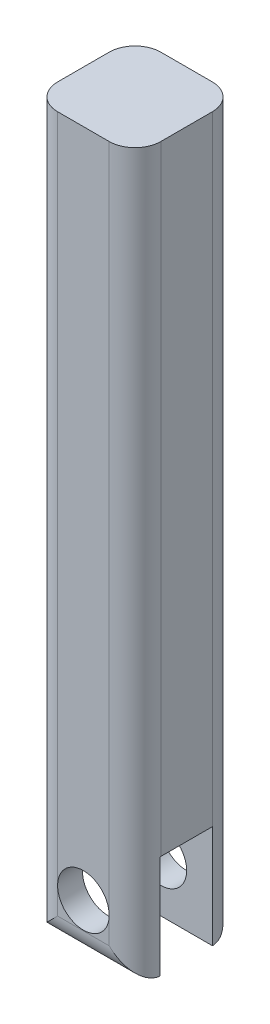
ISO-10303-21;
HEADER;
FILE_DESCRIPTION(('STEP AP214'),'2;1');
FILE_NAME('part.step','',(''),(''),'','','');
FILE_SCHEMA(('AUTOMOTIVE_DESIGN { 1 0 10303 214 1 1 1 1 }'));
ENDSEC;
DATA;
#1=APPLICATION_CONTEXT('core data for automotive mechanical design processes');
#2=APPLICATION_PROTOCOL_DEFINITION('international standard','automotive_design',2000,#1);
#3=PRODUCT_CONTEXT('',#1,'mechanical');
#4=PRODUCT('Part','Part','',(#3));
#5=PRODUCT_RELATED_PRODUCT_CATEGORY('part','',(#4));
#6=PRODUCT_DEFINITION_FORMATION('','',#4);
#7=PRODUCT_DEFINITION_CONTEXT('part definition',#1,'design');
#8=PRODUCT_DEFINITION('design','',#6,#7);
#9=PRODUCT_DEFINITION_SHAPE('','',#8);
#10=(LENGTH_UNIT() NAMED_UNIT(*) SI_UNIT(.MILLI.,.METRE.));
#11=(NAMED_UNIT(*) PLANE_ANGLE_UNIT() SI_UNIT($,.RADIAN.));
#12=(NAMED_UNIT(*) SI_UNIT($,.STERADIAN.) SOLID_ANGLE_UNIT());
#13=UNCERTAINTY_MEASURE_WITH_UNIT(LENGTH_MEASURE(1.E-05),#10,'distance_accuracy_value','');
#14=(GEOMETRIC_REPRESENTATION_CONTEXT(3) GLOBAL_UNCERTAINTY_ASSIGNED_CONTEXT((#13)) GLOBAL_UNIT_ASSIGNED_CONTEXT((#10,
#11,#12)) REPRESENTATION_CONTEXT('',''));
#15=CARTESIAN_POINT('',(0.,0.,0.));
#16=DIRECTION('',(0.,0.,1.));
#17=DIRECTION('',(1.,0.,0.));
#18=AXIS2_PLACEMENT_3D('',#15,#16,#17);
#19=CARTESIAN_POINT('',(-10.,140.,10.));
#20=DIRECTION('',(0.,0.,-1.));
#21=DIRECTION('',(-1.,0.,0.));
#22=AXIS2_PLACEMENT_3D('',#19,#20,#21);
#23=PLANE('',#22);
#24=DIRECTION('',(1.,0.,0.));
#25=VECTOR('',#24,1.);
#26=CARTESIAN_POINT('',(-10.,140.,10.));
#27=LINE('',#26,#25);
#28=CARTESIAN_POINT('',(-5.,140.,10.));
#29=VERTEX_POINT('',#28);
#30=CARTESIAN_POINT('',(5.,140.,10.));
#31=VERTEX_POINT('',#30);
#32=EDGE_CURVE('E181',#29,#31,#27,.T.);
#33=ORIENTED_EDGE('',*,*,#32,.F.);
#34=DIRECTION('',(0.,-1.,0.));
#35=VECTOR('',#34,1.);
#36=CARTESIAN_POINT('',(-5.,140.,10.));
#37=LINE('',#36,#35);
#38=CARTESIAN_POINT('',(-5.,10.1259799613283,10.));
#39=VERTEX_POINT('',#38);
#40=EDGE_CURVE('E210',#29,#39,#37,.T.);
#41=ORIENTED_EDGE('',*,*,#40,.T.);
#42=CARTESIAN_POINT('',(0.,10.1259799613283,10.));
#43=DIRECTION('',(0.,0.,1.));
#44=DIRECTION('',(1.,0.,0.));
#45=AXIS2_PLACEMENT_3D('',#42,#43,#44);
#46=CIRCLE('',#45,5.);
#47=CARTESIAN_POINT('',(5.,10.1259799613283,10.));
#48=VERTEX_POINT('',#47);
#49=EDGE_CURVE('E169',#48,#39,#46,.T.);
#50=ORIENTED_EDGE('',*,*,#49,.F.);
#51=DIRECTION('',(0.,-1.,0.));
#52=VECTOR('',#51,1.);
#53=CARTESIAN_POINT('',(5.,140.,10.));
#54=LINE('',#53,#52);
#55=EDGE_CURVE('E197',#48,#31,#54,.F.);
#56=ORIENTED_EDGE('',*,*,#55,.T.);
#57=EDGE_LOOP('',(#33,#41,#50,#56));
#58=FACE_BOUND('',#57,.T.);
#59=ADVANCED_FACE('F38',(#58),#23,.F.);
#60=CARTESIAN_POINT('',(-10.,140.,-10.));
#61=DIRECTION('',(0.,0.,1.));
#62=DIRECTION('',(1.,0.,0.));
#63=AXIS2_PLACEMENT_3D('',#60,#61,#62);
#64=PLANE('',#63);
#65=CARTESIAN_POINT('',(0.,10.1259799613283,-10.));
#66=DIRECTION('',(0.,0.,1.));
#67=DIRECTION('',(1.,0.,0.));
#68=AXIS2_PLACEMENT_3D('',#65,#66,#67);
#69=CIRCLE('',#68,5.);
#70=CARTESIAN_POINT('',(5.,10.1259799613283,-10.));
#71=VERTEX_POINT('',#70);
#72=CARTESIAN_POINT('',(-5.,10.1259799613283,-10.));
#73=VERTEX_POINT('',#72);
#74=EDGE_CURVE('E148',#71,#73,#69,.T.);
#75=ORIENTED_EDGE('',*,*,#74,.T.);
#76=DIRECTION('',(0.,-1.,0.));
#77=VECTOR('',#76,1.);
#78=CARTESIAN_POINT('',(-5.,140.,-10.));
#79=LINE('',#78,#77);
#80=CARTESIAN_POINT('',(-5.,140.,-10.));
#81=VERTEX_POINT('',#80);
#82=EDGE_CURVE('E194',#73,#81,#79,.F.);
#83=ORIENTED_EDGE('',*,*,#82,.T.);
#84=DIRECTION('',(-1.,0.,0.));
#85=VECTOR('',#84,1.);
#86=CARTESIAN_POINT('',(-10.,140.,-10.));
#87=LINE('',#86,#85);
#88=CARTESIAN_POINT('',(5.,140.,-10.));
#89=VERTEX_POINT('',#88);
#90=EDGE_CURVE('E151',#89,#81,#87,.T.);
#91=ORIENTED_EDGE('',*,*,#90,.F.);
#92=DIRECTION('',(0.,-1.,0.));
#93=VECTOR('',#92,1.);
#94=CARTESIAN_POINT('',(5.,140.,-10.));
#95=LINE('',#94,#93);
#96=EDGE_CURVE('E144',#89,#71,#95,.T.);
#97=ORIENTED_EDGE('',*,*,#96,.T.);
#98=EDGE_LOOP('',(#75,#83,#91,#97));
#99=FACE_BOUND('',#98,.T.);
#100=ADVANCED_FACE('F146',(#99),#64,.F.);
#101=CARTESIAN_POINT('',(0.,10.1259799613283,-10.));
#102=DIRECTION('',(0.,0.,1.));
#103=DIRECTION('',(1.,0.,0.));
#104=AXIS2_PLACEMENT_3D('',#101,#102,#103);
#105=CYLINDRICAL_SURFACE('',#104,5.);
#106=CARTESIAN_POINT('',(0.,10.1259799613283,5.19));
#107=DIRECTION('',(0.,0.,1.));
#108=DIRECTION('',(0.,-1.,0.));
#109=AXIS2_PLACEMENT_3D('',#106,#107,#108);
#110=CIRCLE('',#109,5.);
#111=CARTESIAN_POINT('',(0.,5.12597996132833,5.19));
#112=VERTEX_POINT('',#111);
#113=EDGE_CURVE('E187',#112,#112,#110,.F.);
#114=ORIENTED_EDGE('',*,*,#113,.T.);
#115=EDGE_LOOP('',(#114));
#116=FACE_BOUND('',#115,.T.);
#117=ORIENTED_EDGE('',*,*,#49,.T.);
#118=EDGE_CURVE('E256',#39,#48,#46,.T.);
#119=ORIENTED_EDGE('',*,*,#118,.T.);
#120=EDGE_LOOP('',(#117,#119));
#121=FACE_BOUND('',#120,.T.);
#122=ADVANCED_FACE('F276',(#116,#121),#105,.F.);
#123=CARTESIAN_POINT('',(10.,140.,10.));
#124=DIRECTION('',(-1.,0.,0.));
#125=DIRECTION('',(0.,0.,1.));
#126=AXIS2_PLACEMENT_3D('',#123,#124,#125);
#127=PLANE('',#126);
#128=DIRECTION('',(0.,0.,1.));
#129=VECTOR('',#128,1.);
#130=CARTESIAN_POINT('',(10.,20.,5.19));
#131=LINE('',#130,#129);
#132=CARTESIAN_POINT('',(10.,20.,-5.));
#133=VERTEX_POINT('',#132);
#134=CARTESIAN_POINT('',(10.,20.,5.));
#135=VERTEX_POINT('',#134);
#136=EDGE_CURVE('E240',#133,#135,#131,.T.);
#137=ORIENTED_EDGE('',*,*,#136,.F.);
#138=DIRECTION('',(0.,-1.,0.));
#139=VECTOR('',#138,1.);
#140=CARTESIAN_POINT('',(10.,140.,-5.));
#141=LINE('',#140,#139);
#142=CARTESIAN_POINT('',(10.,140.,-5.));
#143=VERTEX_POINT('',#142);
#144=EDGE_CURVE('E56',#133,#143,#141,.F.);
#145=ORIENTED_EDGE('',*,*,#144,.T.);
#146=DIRECTION('',(0.,0.,-1.));
#147=VECTOR('',#146,1.);
#148=CARTESIAN_POINT('',(10.,140.,10.));
#149=LINE('',#148,#147);
#150=CARTESIAN_POINT('',(10.,140.,5.));
#151=VERTEX_POINT('',#150);
#152=EDGE_CURVE('E173',#151,#143,#149,.T.);
#153=ORIENTED_EDGE('',*,*,#152,.F.);
#154=DIRECTION('',(0.,-1.,0.));
#155=VECTOR('',#154,1.);
#156=CARTESIAN_POINT('',(10.,140.,5.));
#157=LINE('',#156,#155);
#158=EDGE_CURVE('E289',#151,#135,#157,.T.);
#159=ORIENTED_EDGE('',*,*,#158,.T.);
#160=EDGE_LOOP('',(#137,#145,#153,#159));
#161=FACE_BOUND('',#160,.T.);
#162=ADVANCED_FACE('F358',(#161),#127,.F.);
#163=DIRECTION('',(1.,0.,0.));
#164=VECTOR('',#163,1.);
#165=CARTESIAN_POINT('',(-10.,4.99998999998999,-10.));
#166=LINE('',#165,#164);
#167=CARTESIAN_POINT('',(5.,4.99998999999,-10.));
#168=VERTEX_POINT('',#167);
#169=CARTESIAN_POINT('',(-5.,4.99998999999,-10.));
#170=VERTEX_POINT('',#169);
#171=EDGE_CURVE('E156',#168,#170,#166,.F.);
#172=ORIENTED_EDGE('',*,*,#171,.T.);
#173=DIRECTION('',(0.,-1.,0.));
#174=VECTOR('',#173,1.);
#175=CARTESIAN_POINT('',(-5.,140.,-10.));
#176=LINE('',#175,#174);
#177=EDGE_CURVE('E166',#170,#73,#176,.F.);
#178=ORIENTED_EDGE('',*,*,#177,.T.);
#179=EDGE_CURVE('E161',#73,#71,#69,.T.);
#180=ORIENTED_EDGE('',*,*,#179,.T.);
#181=DIRECTION('',(0.,-1.,0.));
#182=VECTOR('',#181,1.);
#183=CARTESIAN_POINT('',(5.,140.,-10.));
#184=LINE('',#183,#182);
#185=EDGE_CURVE('E157',#71,#168,#184,.T.);
#186=ORIENTED_EDGE('',*,*,#185,.T.);
#187=EDGE_LOOP('',(#172,#178,#180,#186));
#188=FACE_BOUND('',#187,.T.);
#189=ADVANCED_FACE('F163',(#188),#64,.F.);
#190=CARTESIAN_POINT('',(-10.,140.,10.));
#191=DIRECTION('',(1.,0.,0.));
#192=DIRECTION('',(0.,0.,-1.));
#193=AXIS2_PLACEMENT_3D('',#190,#191,#192);
#194=PLANE('',#193);
#195=DIRECTION('',(0.,0.,1.));
#196=VECTOR('',#195,1.);
#197=CARTESIAN_POINT('',(-10.,140.,10.));
#198=LINE('',#197,#196);
#199=CARTESIAN_POINT('',(-10.,140.,-5.));
#200=VERTEX_POINT('',#199);
#201=CARTESIAN_POINT('',(-10.,140.,5.));
#202=VERTEX_POINT('',#201);
#203=EDGE_CURVE('E184',#200,#202,#198,.T.);
#204=ORIENTED_EDGE('',*,*,#203,.F.);
#205=DIRECTION('',(0.,-1.,0.));
#206=VECTOR('',#205,1.);
#207=CARTESIAN_POINT('',(-10.,140.,-5.));
#208=LINE('',#207,#206);
#209=CARTESIAN_POINT('',(-10.,20.,-5.));
#210=VERTEX_POINT('',#209);
#211=EDGE_CURVE('E216',#200,#210,#208,.T.);
#212=ORIENTED_EDGE('',*,*,#211,.T.);
#213=DIRECTION('',(0.,0.,1.));
#214=VECTOR('',#213,1.);
#215=CARTESIAN_POINT('',(-10.,20.,5.19));
#216=LINE('',#215,#214);
#217=CARTESIAN_POINT('',(-10.,20.,5.));
#218=VERTEX_POINT('',#217);
#219=EDGE_CURVE('E234',#210,#218,#216,.T.);
#220=ORIENTED_EDGE('',*,*,#219,.T.);
#221=DIRECTION('',(0.,-1.,0.));
#222=VECTOR('',#221,1.);
#223=CARTESIAN_POINT('',(-10.,140.,5.));
#224=LINE('',#223,#222);
#225=EDGE_CURVE('E213',#218,#202,#224,.F.);
#226=ORIENTED_EDGE('',*,*,#225,.T.);
#227=EDGE_LOOP('',(#204,#212,#220,#226));
#228=FACE_BOUND('',#227,.T.);
#229=ADVANCED_FACE('F365',(#228),#194,.F.);
#230=ORIENTED_EDGE('',*,*,#118,.F.);
#231=DIRECTION('',(0.,-1.,0.));
#232=VECTOR('',#231,1.);
#233=CARTESIAN_POINT('',(-5.,140.,10.));
#234=LINE('',#233,#232);
#235=CARTESIAN_POINT('',(-5.,4.99638869584823,10.));
#236=VERTEX_POINT('',#235);
#237=EDGE_CURVE('E207',#39,#236,#234,.T.);
#238=ORIENTED_EDGE('',*,*,#237,.T.);
#239=DIRECTION('',(-1.,0.,0.));
#240=VECTOR('',#239,1.);
#241=CARTESIAN_POINT('',(-10.,4.99638869584823,10.));
#242=LINE('',#241,#240);
#243=CARTESIAN_POINT('',(5.,4.99638869584823,10.));
#244=VERTEX_POINT('',#243);
#245=EDGE_CURVE('E203',#236,#244,#242,.F.);
#246=ORIENTED_EDGE('',*,*,#245,.T.);
#247=DIRECTION('',(0.,-1.,0.));
#248=VECTOR('',#247,1.);
#249=CARTESIAN_POINT('',(5.,140.,10.));
#250=LINE('',#249,#248);
#251=EDGE_CURVE('E200',#244,#48,#250,.F.);
#252=ORIENTED_EDGE('',*,*,#251,.T.);
#253=EDGE_LOOP('',(#230,#238,#246,#252));
#254=FACE_BOUND('',#253,.T.);
#255=ADVANCED_FACE('F371',(#254),#23,.F.);
#256=CARTESIAN_POINT('',(0.,140.,0.));
#257=DIRECTION('',(0.,-1.,0.));
#258=DIRECTION('',(0.,0.,-1.));
#259=AXIS2_PLACEMENT_3D('',#256,#257,#258);
#260=PLANE('',#259);
#261=ORIENTED_EDGE('',*,*,#90,.T.);
#262=CARTESIAN_POINT('',(-5.,140.,-5.));
#263=DIRECTION('',(0.,-1.,0.));
#264=DIRECTION('',(0.,0.,-1.));
#265=AXIS2_PLACEMENT_3D('',#262,#263,#264);
#266=CIRCLE('',#265,5.);
#267=EDGE_CURVE('E305',#81,#200,#266,.F.);
#268=ORIENTED_EDGE('',*,*,#267,.T.);
#269=ORIENTED_EDGE('',*,*,#203,.T.);
#270=CARTESIAN_POINT('',(-5.,140.,5.));
#271=DIRECTION('',(0.,-1.,0.));
#272=DIRECTION('',(0.,0.,-1.));
#273=AXIS2_PLACEMENT_3D('',#270,#271,#272);
#274=CIRCLE('',#273,5.);
#275=EDGE_CURVE('E291',#202,#29,#274,.F.);
#276=ORIENTED_EDGE('',*,*,#275,.T.);
#277=ORIENTED_EDGE('',*,*,#32,.T.);
#278=CARTESIAN_POINT('',(5.,140.,5.));
#279=DIRECTION('',(0.,-1.,0.));
#280=DIRECTION('',(0.,0.,-1.));
#281=AXIS2_PLACEMENT_3D('',#278,#279,#280);
#282=CIRCLE('',#281,5.);
#283=EDGE_CURVE('E63',#31,#151,#282,.F.);
#284=ORIENTED_EDGE('',*,*,#283,.T.);
#285=ORIENTED_EDGE('',*,*,#152,.T.);
#286=CARTESIAN_POINT('',(5.,140.,-5.));
#287=DIRECTION('',(0.,-1.,0.));
#288=DIRECTION('',(0.,0.,-1.));
#289=AXIS2_PLACEMENT_3D('',#286,#287,#288);
#290=CIRCLE('',#289,5.);
#291=EDGE_CURVE('E296',#143,#89,#290,.F.);
#292=ORIENTED_EDGE('',*,*,#291,.T.);
#293=EDGE_LOOP('',(#261,#268,#269,#276,#277,#284,#285,#292));
#294=FACE_BOUND('',#293,.T.);
#295=ADVANCED_FACE('F356',(#294),#260,.F.);
#296=CARTESIAN_POINT('',(0.,10.1259799613283,-5.01));
#297=DIRECTION('',(0.,0.,-1.));
#298=DIRECTION('',(-1.,0.,0.));
#299=AXIS2_PLACEMENT_3D('',#296,#297,#298);
#300=CIRCLE('',#299,5.);
#301=CARTESIAN_POINT('',(-5.,10.1259799613283,-5.01));
#302=VERTEX_POINT('',#301);
#303=EDGE_CURVE('E247',#302,#302,#300,.F.);
#304=ORIENTED_EDGE('',*,*,#303,.T.);
#305=EDGE_LOOP('',(#304));
#306=FACE_BOUND('',#305,.T.);
#307=ORIENTED_EDGE('',*,*,#74,.F.);
#308=ORIENTED_EDGE('',*,*,#179,.F.);
#309=EDGE_LOOP('',(#307,#308));
#310=FACE_BOUND('',#309,.T.);
#311=ADVANCED_FACE('F171',(#306,#310),#105,.F.);
#312=CARTESIAN_POINT('',(-10.,0.,5.19));
#313=DIRECTION('',(0.,0.,1.));
#314=DIRECTION('',(0.,-1.,0.));
#315=AXIS2_PLACEMENT_3D('',#312,#313,#314);
#316=PLANE('',#315);
#317=DIRECTION('',(1.,0.,0.));
#318=VECTOR('',#317,1.);
#319=CARTESIAN_POINT('',(-10.,0.,5.19));
#320=LINE('',#319,#318);
#321=CARTESIAN_POINT('',(-9.99638869584823,0.,5.19));
#322=VERTEX_POINT('',#321);
#323=CARTESIAN_POINT('',(9.99638869584823,0.,5.19));
#324=VERTEX_POINT('',#323);
#325=EDGE_CURVE('E233',#322,#324,#320,.T.);
#326=ORIENTED_EDGE('',*,*,#325,.F.);
#327=DIRECTION('',(0.,-1.,0.));
#328=VECTOR('',#327,1.);
#329=CARTESIAN_POINT('',(-9.99638869584823,0.,5.19));
#330=LINE('',#329,#328);
#331=CARTESIAN_POINT('',(-9.99638869584823,20.,5.19));
#332=VERTEX_POINT('',#331);
#333=EDGE_CURVE('E11',#322,#332,#330,.F.);
#334=ORIENTED_EDGE('',*,*,#333,.T.);
#335=DIRECTION('',(1.,0.,0.));
#336=VECTOR('',#335,1.);
#337=CARTESIAN_POINT('',(-10.,20.,5.19));
#338=LINE('',#337,#336);
#339=CARTESIAN_POINT('',(9.99638869584823,20.,5.19));
#340=VERTEX_POINT('',#339);
#341=EDGE_CURVE('E224',#332,#340,#338,.T.);
#342=ORIENTED_EDGE('',*,*,#341,.T.);
#343=DIRECTION('',(0.,-1.,0.));
#344=VECTOR('',#343,1.);
#345=CARTESIAN_POINT('',(9.99638869584823,20.,5.19));
#346=LINE('',#345,#344);
#347=EDGE_CURVE('E48',#340,#324,#346,.T.);
#348=ORIENTED_EDGE('',*,*,#347,.T.);
#349=EDGE_LOOP('',(#326,#334,#342,#348));
#350=FACE_BOUND('',#349,.T.);
#351=ORIENTED_EDGE('',*,*,#113,.F.);
#352=EDGE_LOOP('',(#351));
#353=FACE_BOUND('',#352,.T.);
#354=ADVANCED_FACE('F333',(#350,#353),#316,.F.);
#355=CARTESIAN_POINT('',(-10.,0.,-5.01));
#356=DIRECTION('',(0.,0.,-1.));
#357=DIRECTION('',(-1.,0.,0.));
#358=AXIS2_PLACEMENT_3D('',#355,#356,#357);
#359=PLANE('',#358);
#360=DIRECTION('',(1.,0.,0.));
#361=VECTOR('',#360,1.);
#362=CARTESIAN_POINT('',(-10.,20.,-5.01));
#363=LINE('',#362,#361);
#364=CARTESIAN_POINT('',(-9.9999975,20.,-5.01));
#365=VERTEX_POINT('',#364);
#366=CARTESIAN_POINT('',(9.9999975,20.,-5.01));
#367=VERTEX_POINT('',#366);
#368=EDGE_CURVE('E220',#365,#367,#363,.T.);
#369=ORIENTED_EDGE('',*,*,#368,.F.);
#370=DIRECTION('',(0.,-1.,0.));
#371=VECTOR('',#370,1.);
#372=CARTESIAN_POINT('',(-9.99998999999,20.,-5.01));
#373=LINE('',#372,#371);
#374=CARTESIAN_POINT('',(-9.99998999999,0.,-5.01));
#375=VERTEX_POINT('',#374);
#376=EDGE_CURVE('E292',#365,#375,#373,.T.);
#377=ORIENTED_EDGE('',*,*,#376,.T.);
#378=DIRECTION('',(1.,0.,0.));
#379=VECTOR('',#378,1.);
#380=CARTESIAN_POINT('',(-10.,0.,-5.01));
#381=LINE('',#380,#379);
#382=CARTESIAN_POINT('',(9.99998999999,0.,-5.01));
#383=VERTEX_POINT('',#382);
#384=EDGE_CURVE('E225',#375,#383,#381,.T.);
#385=ORIENTED_EDGE('',*,*,#384,.T.);
#386=DIRECTION('',(0.,-1.,0.));
#387=VECTOR('',#386,1.);
#388=CARTESIAN_POINT('',(9.99998999999,0.,-5.01));
#389=LINE('',#388,#387);
#390=EDGE_CURVE('E298',#383,#367,#389,.F.);
#391=ORIENTED_EDGE('',*,*,#390,.T.);
#392=EDGE_LOOP('',(#369,#377,#385,#391));
#393=FACE_BOUND('',#392,.T.);
#394=ORIENTED_EDGE('',*,*,#303,.F.);
#395=EDGE_LOOP('',(#394));
#396=FACE_BOUND('',#395,.T.);
#397=ADVANCED_FACE('F351',(#393,#396),#359,.F.);
#398=CARTESIAN_POINT('',(-10.,20.,5.19));
#399=DIRECTION('',(0.,1.,0.));
#400=DIRECTION('',(0.,0.,1.));
#401=AXIS2_PLACEMENT_3D('',#398,#399,#400);
#402=PLANE('',#401);
#403=ORIENTED_EDGE('',*,*,#368,.T.);
#404=CARTESIAN_POINT('',(5.,20.,-5.));
#405=DIRECTION('',(0.,1.,0.));
#406=DIRECTION('',(0.,0.,1.));
#407=AXIS2_PLACEMENT_3D('',#404,#405,#406);
#408=CIRCLE('',#407,5.);
#409=EDGE_CURVE('E341',#367,#133,#408,.F.);
#410=ORIENTED_EDGE('',*,*,#409,.T.);
#411=ORIENTED_EDGE('',*,*,#136,.T.);
#412=CARTESIAN_POINT('',(5.,20.,5.));
#413=DIRECTION('',(0.,1.,0.));
#414=DIRECTION('',(0.,0.,1.));
#415=AXIS2_PLACEMENT_3D('',#412,#413,#414);
#416=CIRCLE('',#415,5.);
#417=EDGE_CURVE('E219',#135,#340,#416,.F.);
#418=ORIENTED_EDGE('',*,*,#417,.T.);
#419=ORIENTED_EDGE('',*,*,#341,.F.);
#420=CARTESIAN_POINT('',(-5.,20.,5.));
#421=DIRECTION('',(0.,1.,0.));
#422=DIRECTION('',(0.,0.,1.));
#423=AXIS2_PLACEMENT_3D('',#420,#421,#422);
#424=CIRCLE('',#423,5.);
#425=EDGE_CURVE('E330',#332,#218,#424,.F.);
#426=ORIENTED_EDGE('',*,*,#425,.T.);
#427=ORIENTED_EDGE('',*,*,#219,.F.);
#428=EDGE_CURVE('E228',#365,#210,#216,.T.);
#429=ORIENTED_EDGE('',*,*,#428,.F.);
#430=EDGE_LOOP('',(#403,#410,#411,#418,#419,#426,#427,#429));
#431=FACE_BOUND('',#430,.T.);
#432=ADVANCED_FACE('F337',(#431),#402,.F.);
#433=CARTESIAN_POINT('',(5.,140.,-5.));
#434=DIRECTION('',(0.,-1.,0.));
#435=DIRECTION('',(0.,0.,-1.));
#436=AXIS2_PLACEMENT_3D('',#433,#434,#435);
#437=CYLINDRICAL_SURFACE('',#436,5.);
#438=ORIENTED_EDGE('',*,*,#409,.F.);
#439=ORIENTED_EDGE('',*,*,#390,.F.);
#440=CARTESIAN_POINT('',(5.,4.99998999999,-5.));
#441=DIRECTION('',(-0.707106781186547,-0.707106781186547,0.));
#442=DIRECTION('',(0.707106781186547,-0.707106781186547,0.));
#443=AXIS2_PLACEMENT_3D('',#440,#441,#442);
#444=ELLIPSE('',#443,7.07106781186547,5.);
#445=EDGE_CURVE('E178',#168,#383,#444,.T.);
#446=ORIENTED_EDGE('',*,*,#445,.F.);
#447=ORIENTED_EDGE('',*,*,#185,.F.);
#448=ORIENTED_EDGE('',*,*,#96,.F.);
#449=ORIENTED_EDGE('',*,*,#291,.F.);
#450=ORIENTED_EDGE('',*,*,#144,.F.);
#451=EDGE_LOOP('',(#438,#439,#446,#447,#448,#449,#450));
#452=FACE_BOUND('',#451,.T.);
#453=ADVANCED_FACE('F175',(#452),#437,.T.);
#454=CARTESIAN_POINT('',(-5.,140.,-5.));
#455=DIRECTION('',(0.,-1.,0.));
#456=DIRECTION('',(0.,0.,-1.));
#457=AXIS2_PLACEMENT_3D('',#454,#455,#456);
#458=CYLINDRICAL_SURFACE('',#457,5.);
#459=ORIENTED_EDGE('',*,*,#82,.F.);
#460=ORIENTED_EDGE('',*,*,#177,.F.);
#461=CARTESIAN_POINT('',(-5.,4.99998999999,-5.));
#462=DIRECTION('',(0.707106781186547,-0.707106781186547,0.));
#463=DIRECTION('',(-0.707106781186547,-0.707106781186547,0.));
#464=AXIS2_PLACEMENT_3D('',#461,#462,#463);
#465=ELLIPSE('',#464,7.07106781186547,5.);
#466=EDGE_CURVE('E314',#375,#170,#465,.T.);
#467=ORIENTED_EDGE('',*,*,#466,.F.);
#468=ORIENTED_EDGE('',*,*,#376,.F.);
#469=ORIENTED_EDGE('',*,*,#428,.T.);
#470=ORIENTED_EDGE('',*,*,#211,.F.);
#471=ORIENTED_EDGE('',*,*,#267,.F.);
#472=EDGE_LOOP('',(#459,#460,#467,#468,#469,#470,#471));
#473=FACE_BOUND('',#472,.T.);
#474=ADVANCED_FACE('F389',(#473),#458,.T.);
#475=CARTESIAN_POINT('',(0.,4.99998999999,-5.));
#476=DIRECTION('',(1.,0.,0.));
#477=DIRECTION('',(0.,0.,-1.));
#478=AXIS2_PLACEMENT_3D('',#475,#476,#477);
#479=CYLINDRICAL_SURFACE('',#478,5.);
#480=ORIENTED_EDGE('',*,*,#445,.T.);
#481=ORIENTED_EDGE('',*,*,#384,.F.);
#482=ORIENTED_EDGE('',*,*,#466,.T.);
#483=ORIENTED_EDGE('',*,*,#171,.F.);
#484=EDGE_LOOP('',(#480,#481,#482,#483));
#485=FACE_BOUND('',#484,.T.);
#486=ADVANCED_FACE('F392',(#485),#479,.T.);
#487=CARTESIAN_POINT('',(-5.,140.,5.));
#488=DIRECTION('',(0.,-1.,0.));
#489=DIRECTION('',(0.,0.,-1.));
#490=AXIS2_PLACEMENT_3D('',#487,#488,#489);
#491=CYLINDRICAL_SURFACE('',#490,5.);
#492=ORIENTED_EDGE('',*,*,#425,.F.);
#493=ORIENTED_EDGE('',*,*,#333,.F.);
#494=CARTESIAN_POINT('',(-5.,4.99638869584823,5.));
#495=DIRECTION('',(0.707106781186547,-0.707106781186547,0.));
#496=DIRECTION('',(-0.707106781186547,-0.707106781186547,0.));
#497=AXIS2_PLACEMENT_3D('',#494,#495,#496);
#498=ELLIPSE('',#497,7.07106781186547,5.);
#499=EDGE_CURVE('E42',#236,#322,#498,.T.);
#500=ORIENTED_EDGE('',*,*,#499,.F.);
#501=ORIENTED_EDGE('',*,*,#237,.F.);
#502=ORIENTED_EDGE('',*,*,#40,.F.);
#503=ORIENTED_EDGE('',*,*,#275,.F.);
#504=ORIENTED_EDGE('',*,*,#225,.F.);
#505=EDGE_LOOP('',(#492,#493,#500,#501,#502,#503,#504));
#506=FACE_BOUND('',#505,.T.);
#507=ADVANCED_FACE('F40',(#506),#491,.T.);
#508=CARTESIAN_POINT('',(5.,140.,5.));
#509=DIRECTION('',(0.,-1.,0.));
#510=DIRECTION('',(0.,0.,-1.));
#511=AXIS2_PLACEMENT_3D('',#508,#509,#510);
#512=CYLINDRICAL_SURFACE('',#511,5.);
#513=ORIENTED_EDGE('',*,*,#55,.F.);
#514=ORIENTED_EDGE('',*,*,#251,.F.);
#515=CARTESIAN_POINT('',(5.,4.99638869584823,5.));
#516=DIRECTION('',(-0.707106781186547,-0.707106781186547,0.));
#517=DIRECTION('',(0.707106781186547,-0.707106781186547,0.));
#518=AXIS2_PLACEMENT_3D('',#515,#516,#517);
#519=ELLIPSE('',#518,7.07106781186547,5.);
#520=EDGE_CURVE('E318',#324,#244,#519,.T.);
#521=ORIENTED_EDGE('',*,*,#520,.F.);
#522=ORIENTED_EDGE('',*,*,#347,.F.);
#523=ORIENTED_EDGE('',*,*,#417,.F.);
#524=ORIENTED_EDGE('',*,*,#158,.F.);
#525=ORIENTED_EDGE('',*,*,#283,.F.);
#526=EDGE_LOOP('',(#513,#514,#521,#522,#523,#524,#525));
#527=FACE_BOUND('',#526,.T.);
#528=ADVANCED_FACE('F285',(#527),#512,.T.);
#529=CARTESIAN_POINT('',(0.,4.99638869584823,5.));
#530=DIRECTION('',(-1.,0.,0.));
#531=DIRECTION('',(0.,0.,1.));
#532=AXIS2_PLACEMENT_3D('',#529,#530,#531);
#533=CYLINDRICAL_SURFACE('',#532,5.);
#534=ORIENTED_EDGE('',*,*,#499,.T.);
#535=ORIENTED_EDGE('',*,*,#325,.T.);
#536=ORIENTED_EDGE('',*,*,#520,.T.);
#537=ORIENTED_EDGE('',*,*,#245,.F.);
#538=EDGE_LOOP('',(#534,#535,#536,#537));
#539=FACE_BOUND('',#538,.T.);
#540=ADVANCED_FACE('F325',(#539),#533,.T.);
#541=CLOSED_SHELL('',(#59,#100,#122,#162,#189,#229,#255,#295,#311,#354,#397,#432,#453,#474,#486,
#507,#528,#540));
#542=MANIFOLD_SOLID_BREP('B2',#541);
#543=ADVANCED_BREP_SHAPE_REPRESENTATION('',(#18,#542),#14);
#544=SHAPE_DEFINITION_REPRESENTATION(#9,#543);
ENDSEC;
END-ISO-10303-21;
